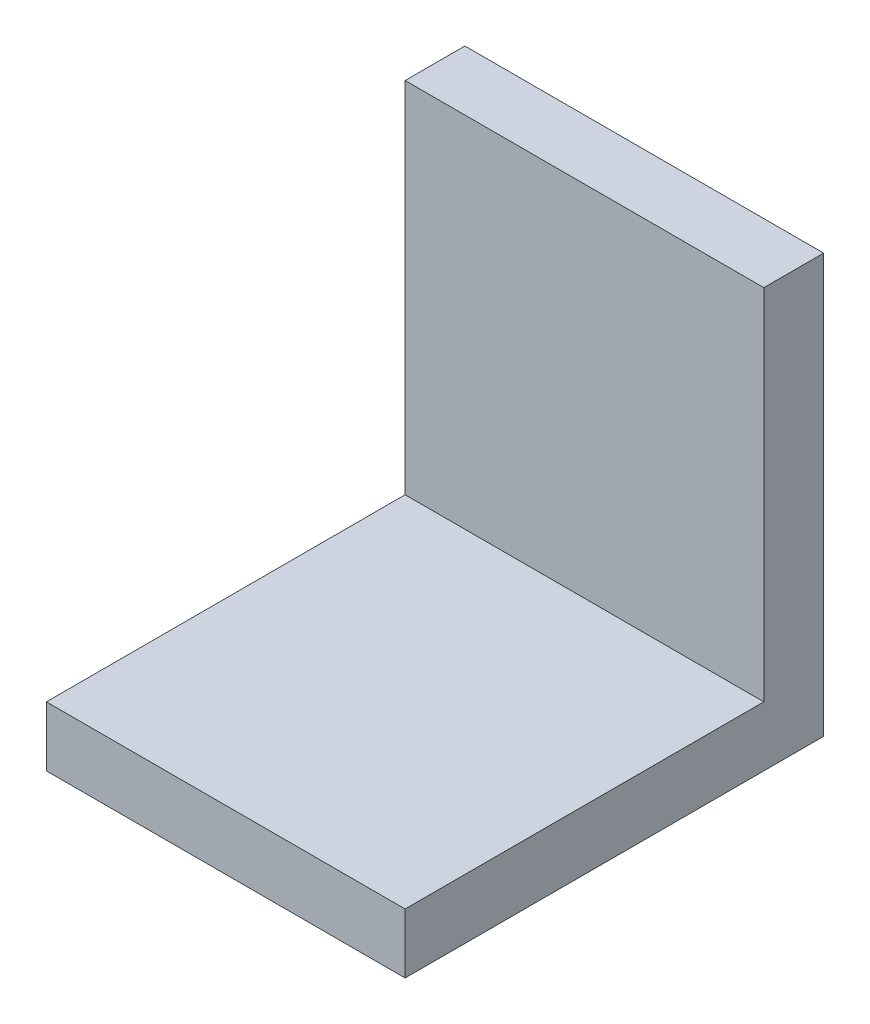
ISO-10303-21;
HEADER;
FILE_DESCRIPTION(('STEP AP214'),'2;1');
FILE_NAME('part.step','',(''),(''),'','','');
FILE_SCHEMA(('AUTOMOTIVE_DESIGN { 1 0 10303 214 1 1 1 1 }'));
ENDSEC;
DATA;
#1=APPLICATION_CONTEXT('core data for automotive mechanical design processes');
#2=APPLICATION_PROTOCOL_DEFINITION('international standard','automotive_design',2000,#1);
#3=PRODUCT_CONTEXT('',#1,'mechanical');
#4=PRODUCT('Part','Part','',(#3));
#5=PRODUCT_RELATED_PRODUCT_CATEGORY('part','',(#4));
#6=PRODUCT_DEFINITION_FORMATION('','',#4);
#7=PRODUCT_DEFINITION_CONTEXT('part definition',#1,'design');
#8=PRODUCT_DEFINITION('design','',#6,#7);
#9=PRODUCT_DEFINITION_SHAPE('','',#8);
#10=(LENGTH_UNIT() NAMED_UNIT(*) SI_UNIT(.MILLI.,.METRE.));
#11=(NAMED_UNIT(*) PLANE_ANGLE_UNIT() SI_UNIT($,.RADIAN.));
#12=(NAMED_UNIT(*) SI_UNIT($,.STERADIAN.) SOLID_ANGLE_UNIT());
#13=UNCERTAINTY_MEASURE_WITH_UNIT(LENGTH_MEASURE(1.E-05),#10,'distance_accuracy_value','');
#14=(GEOMETRIC_REPRESENTATION_CONTEXT(3) GLOBAL_UNCERTAINTY_ASSIGNED_CONTEXT((#13)) GLOBAL_UNIT_ASSIGNED_CONTEXT((#10,
#11,#12)) REPRESENTATION_CONTEXT('',''));
#15=CARTESIAN_POINT('',(0.,0.,0.));
#16=DIRECTION('',(0.,0.,1.));
#17=DIRECTION('',(1.,0.,0.));
#18=AXIS2_PLACEMENT_3D('',#15,#16,#17);
#19=CARTESIAN_POINT('',(30.,35.,0.));
#20=DIRECTION('',(0.,0.,1.));
#21=DIRECTION('',(1.,0.,0.));
#22=AXIS2_PLACEMENT_3D('',#19,#20,#21);
#23=PLANE('',#22);
#24=DIRECTION('',(0.,1.,0.));
#25=VECTOR('',#24,1.);
#26=CARTESIAN_POINT('',(0.,35.,0.));
#27=LINE('',#26,#25);
#28=CARTESIAN_POINT('',(0.,0.,0.));
#29=VERTEX_POINT('',#28);
#30=CARTESIAN_POINT('',(0.,35.,0.));
#31=VERTEX_POINT('',#30);
#32=EDGE_CURVE('E119',#29,#31,#27,.T.);
#33=ORIENTED_EDGE('',*,*,#32,.T.);
#34=DIRECTION('',(-1.,0.,0.));
#35=VECTOR('',#34,1.);
#36=CARTESIAN_POINT('',(30.,35.,0.));
#37=LINE('',#36,#35);
#38=CARTESIAN_POINT('',(30.,35.,0.));
#39=VERTEX_POINT('',#38);
#40=EDGE_CURVE('E11',#39,#31,#37,.T.);
#41=ORIENTED_EDGE('',*,*,#40,.F.);
#42=DIRECTION('',(0.,1.,0.));
#43=VECTOR('',#42,1.);
#44=CARTESIAN_POINT('',(30.,35.,0.));
#45=LINE('',#44,#43);
#46=CARTESIAN_POINT('',(30.,0.,0.));
#47=VERTEX_POINT('',#46);
#48=EDGE_CURVE('E129',#47,#39,#45,.T.);
#49=ORIENTED_EDGE('',*,*,#48,.F.);
#50=DIRECTION('',(-1.,0.,0.));
#51=VECTOR('',#50,1.);
#52=CARTESIAN_POINT('',(30.,0.,0.));
#53=LINE('',#52,#51);
#54=EDGE_CURVE('E115',#47,#29,#53,.T.);
#55=ORIENTED_EDGE('',*,*,#54,.T.);
#56=EDGE_LOOP('',(#33,#41,#49,#55));
#57=FACE_BOUND('',#56,.T.);
#58=ADVANCED_FACE('F35',(#57),#23,.F.);
#59=CARTESIAN_POINT('',(30.,35.,5.));
#60=DIRECTION('',(0.,-1.,0.));
#61=DIRECTION('',(0.,0.,-1.));
#62=AXIS2_PLACEMENT_3D('',#59,#60,#61);
#63=PLANE('',#62);
#64=DIRECTION('',(0.,0.,1.));
#65=VECTOR('',#64,1.);
#66=CARTESIAN_POINT('',(0.,35.,5.));
#67=LINE('',#66,#65);
#68=CARTESIAN_POINT('',(0.,35.,5.));
#69=VERTEX_POINT('',#68);
#70=EDGE_CURVE('E122',#31,#69,#67,.T.);
#71=ORIENTED_EDGE('',*,*,#70,.T.);
#72=DIRECTION('',(-1.,0.,0.));
#73=VECTOR('',#72,1.);
#74=CARTESIAN_POINT('',(30.,35.,5.));
#75=LINE('',#74,#73);
#76=CARTESIAN_POINT('',(30.,35.,5.));
#77=VERTEX_POINT('',#76);
#78=EDGE_CURVE('E43',#77,#69,#75,.T.);
#79=ORIENTED_EDGE('',*,*,#78,.F.);
#80=DIRECTION('',(0.,0.,1.));
#81=VECTOR('',#80,1.);
#82=CARTESIAN_POINT('',(30.,35.,5.));
#83=LINE('',#82,#81);
#84=EDGE_CURVE('E88',#39,#77,#83,.T.);
#85=ORIENTED_EDGE('',*,*,#84,.F.);
#86=ORIENTED_EDGE('',*,*,#40,.T.);
#87=EDGE_LOOP('',(#71,#79,#85,#86));
#88=FACE_BOUND('',#87,.T.);
#89=ADVANCED_FACE('F153',(#88),#63,.F.);
#90=CARTESIAN_POINT('',(30.,5.,5.));
#91=DIRECTION('',(0.,0.,-1.));
#92=DIRECTION('',(0.,1.,0.));
#93=AXIS2_PLACEMENT_3D('',#90,#91,#92);
#94=PLANE('',#93);
#95=DIRECTION('',(0.,-1.,0.));
#96=VECTOR('',#95,1.);
#97=CARTESIAN_POINT('',(0.,5.,5.));
#98=LINE('',#97,#96);
#99=CARTESIAN_POINT('',(0.,5.,5.));
#100=VERTEX_POINT('',#99);
#101=EDGE_CURVE('E124',#69,#100,#98,.T.);
#102=ORIENTED_EDGE('',*,*,#101,.T.);
#103=DIRECTION('',(-1.,0.,0.));
#104=VECTOR('',#103,1.);
#105=CARTESIAN_POINT('',(30.,5.,5.));
#106=LINE('',#105,#104);
#107=CARTESIAN_POINT('',(30.,5.,5.));
#108=VERTEX_POINT('',#107);
#109=EDGE_CURVE('E110',#108,#100,#106,.T.);
#110=ORIENTED_EDGE('',*,*,#109,.F.);
#111=DIRECTION('',(0.,-1.,0.));
#112=VECTOR('',#111,1.);
#113=CARTESIAN_POINT('',(30.,5.,5.));
#114=LINE('',#113,#112);
#115=EDGE_CURVE('E101',#77,#108,#114,.T.);
#116=ORIENTED_EDGE('',*,*,#115,.F.);
#117=ORIENTED_EDGE('',*,*,#78,.T.);
#118=EDGE_LOOP('',(#102,#110,#116,#117));
#119=FACE_BOUND('',#118,.T.);
#120=ADVANCED_FACE('F135',(#119),#94,.F.);
#121=CARTESIAN_POINT('',(30.,4.99999999999999,35.));
#122=DIRECTION('',(0.,-1.,0.));
#123=DIRECTION('',(0.,0.,-1.));
#124=AXIS2_PLACEMENT_3D('',#121,#122,#123);
#125=PLANE('',#124);
#126=DIRECTION('',(0.,0.,1.));
#127=VECTOR('',#126,1.);
#128=CARTESIAN_POINT('',(0.,4.99999999999999,35.));
#129=LINE('',#128,#127);
#130=CARTESIAN_POINT('',(0.,4.99999999999999,35.));
#131=VERTEX_POINT('',#130);
#132=EDGE_CURVE('E109',#100,#131,#129,.T.);
#133=ORIENTED_EDGE('',*,*,#132,.T.);
#134=DIRECTION('',(-1.,0.,0.));
#135=VECTOR('',#134,1.);
#136=CARTESIAN_POINT('',(30.,4.99999999999999,35.));
#137=LINE('',#136,#135);
#138=CARTESIAN_POINT('',(30.,4.99999999999999,35.));
#139=VERTEX_POINT('',#138);
#140=EDGE_CURVE('E106',#139,#131,#137,.T.);
#141=ORIENTED_EDGE('',*,*,#140,.F.);
#142=DIRECTION('',(0.,0.,1.));
#143=VECTOR('',#142,1.);
#144=CARTESIAN_POINT('',(30.,4.99999999999999,35.));
#145=LINE('',#144,#143);
#146=EDGE_CURVE('E95',#108,#139,#145,.T.);
#147=ORIENTED_EDGE('',*,*,#146,.F.);
#148=ORIENTED_EDGE('',*,*,#109,.T.);
#149=EDGE_LOOP('',(#133,#141,#147,#148));
#150=FACE_BOUND('',#149,.T.);
#151=ADVANCED_FACE('F107',(#150),#125,.F.);
#152=CARTESIAN_POINT('',(30.,0.,35.));
#153=DIRECTION('',(0.,0.,-1.));
#154=DIRECTION('',(0.,1.,0.));
#155=AXIS2_PLACEMENT_3D('',#152,#153,#154);
#156=PLANE('',#155);
#157=DIRECTION('',(0.,-1.,0.));
#158=VECTOR('',#157,1.);
#159=CARTESIAN_POINT('',(0.,0.,35.));
#160=LINE('',#159,#158);
#161=CARTESIAN_POINT('',(0.,0.,35.));
#162=VERTEX_POINT('',#161);
#163=EDGE_CURVE('E74',#131,#162,#160,.T.);
#164=ORIENTED_EDGE('',*,*,#163,.T.);
#165=DIRECTION('',(-1.,0.,0.));
#166=VECTOR('',#165,1.);
#167=CARTESIAN_POINT('',(30.,0.,35.));
#168=LINE('',#167,#166);
#169=CARTESIAN_POINT('',(30.,0.,35.));
#170=VERTEX_POINT('',#169);
#171=EDGE_CURVE('E111',#170,#162,#168,.T.);
#172=ORIENTED_EDGE('',*,*,#171,.F.);
#173=DIRECTION('',(0.,-1.,0.));
#174=VECTOR('',#173,1.);
#175=CARTESIAN_POINT('',(30.,0.,35.));
#176=LINE('',#175,#174);
#177=EDGE_CURVE('E99',#139,#170,#176,.T.);
#178=ORIENTED_EDGE('',*,*,#177,.F.);
#179=ORIENTED_EDGE('',*,*,#140,.T.);
#180=EDGE_LOOP('',(#164,#172,#178,#179));
#181=FACE_BOUND('',#180,.T.);
#182=ADVANCED_FACE('F113',(#181),#156,.F.);
#183=CARTESIAN_POINT('',(30.,0.,0.));
#184=DIRECTION('',(0.,1.,0.));
#185=DIRECTION('',(0.,0.,1.));
#186=AXIS2_PLACEMENT_3D('',#183,#184,#185);
#187=PLANE('',#186);
#188=DIRECTION('',(0.,0.,-1.));
#189=VECTOR('',#188,1.);
#190=CARTESIAN_POINT('',(0.,0.,0.));
#191=LINE('',#190,#189);
#192=EDGE_CURVE('E80',#162,#29,#191,.T.);
#193=ORIENTED_EDGE('',*,*,#192,.T.);
#194=ORIENTED_EDGE('',*,*,#54,.F.);
#195=DIRECTION('',(0.,0.,-1.));
#196=VECTOR('',#195,1.);
#197=CARTESIAN_POINT('',(30.,0.,0.));
#198=LINE('',#197,#196);
#199=EDGE_CURVE('E51',#170,#47,#198,.T.);
#200=ORIENTED_EDGE('',*,*,#199,.F.);
#201=ORIENTED_EDGE('',*,*,#171,.T.);
#202=EDGE_LOOP('',(#193,#194,#200,#201));
#203=FACE_BOUND('',#202,.T.);
#204=ADVANCED_FACE('F142',(#203),#187,.F.);
#205=CARTESIAN_POINT('',(30.,0.,0.));
#206=DIRECTION('',(-1.,0.,0.));
#207=DIRECTION('',(0.,0.,1.));
#208=AXIS2_PLACEMENT_3D('',#205,#206,#207);
#209=PLANE('',#208);
#210=ORIENTED_EDGE('',*,*,#48,.T.);
#211=ORIENTED_EDGE('',*,*,#84,.T.);
#212=ORIENTED_EDGE('',*,*,#115,.T.);
#213=ORIENTED_EDGE('',*,*,#146,.T.);
#214=ORIENTED_EDGE('',*,*,#177,.T.);
#215=ORIENTED_EDGE('',*,*,#199,.T.);
#216=EDGE_LOOP('',(#210,#211,#212,#213,#214,#215));
#217=FACE_BOUND('',#216,.T.);
#218=ADVANCED_FACE('F97',(#217),#209,.F.);
#219=CARTESIAN_POINT('',(0.,0.,0.));
#220=DIRECTION('',(-1.,0.,0.));
#221=DIRECTION('',(0.,0.,1.));
#222=AXIS2_PLACEMENT_3D('',#219,#220,#221);
#223=PLANE('',#222);
#224=ORIENTED_EDGE('',*,*,#32,.F.);
#225=ORIENTED_EDGE('',*,*,#192,.F.);
#226=ORIENTED_EDGE('',*,*,#163,.F.);
#227=ORIENTED_EDGE('',*,*,#132,.F.);
#228=ORIENTED_EDGE('',*,*,#101,.F.);
#229=ORIENTED_EDGE('',*,*,#70,.F.);
#230=EDGE_LOOP('',(#224,#225,#226,#227,#228,#229));
#231=FACE_BOUND('',#230,.T.);
#232=ADVANCED_FACE('F138',(#231),#223,.T.);
#233=CLOSED_SHELL('',(#58,#89,#120,#151,#182,#204,#218,#232));
#234=MANIFOLD_SOLID_BREP('B2',#233);
#235=ADVANCED_BREP_SHAPE_REPRESENTATION('',(#18,#234),#14);
#236=SHAPE_DEFINITION_REPRESENTATION(#9,#235);
ENDSEC;
END-ISO-10303-21;
